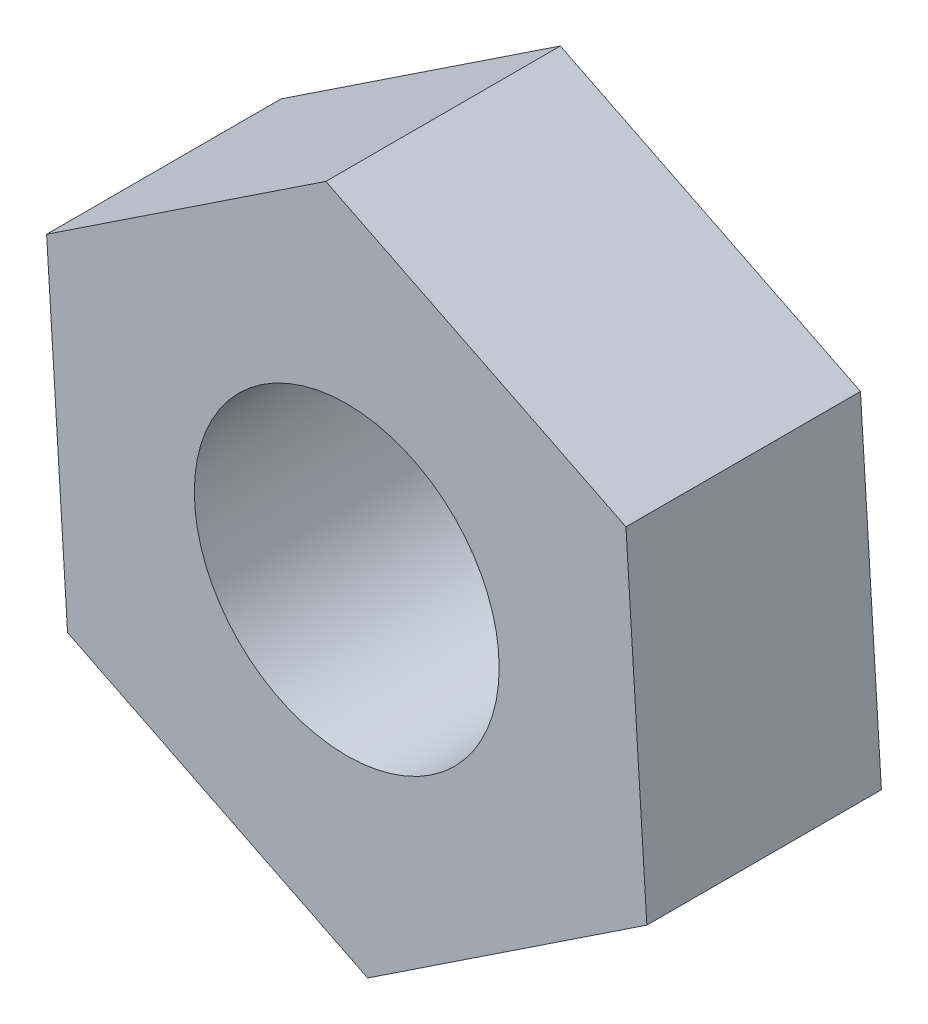
ISO-10303-21;
HEADER;
FILE_DESCRIPTION(('STEP AP214'),'2;1');
FILE_NAME('part.step','',(''),(''),'','','');
FILE_SCHEMA(('AUTOMOTIVE_DESIGN { 1 0 10303 214 1 1 1 1 }'));
ENDSEC;
DATA;
#1=APPLICATION_CONTEXT('core data for automotive mechanical design processes');
#2=APPLICATION_PROTOCOL_DEFINITION('international standard','automotive_design',2000,#1);
#3=PRODUCT_CONTEXT('',#1,'mechanical');
#4=PRODUCT('Part','Part','',(#3));
#5=PRODUCT_RELATED_PRODUCT_CATEGORY('part','',(#4));
#6=PRODUCT_DEFINITION_FORMATION('','',#4);
#7=PRODUCT_DEFINITION_CONTEXT('part definition',#1,'design');
#8=PRODUCT_DEFINITION('design','',#6,#7);
#9=PRODUCT_DEFINITION_SHAPE('','',#8);
#10=(LENGTH_UNIT() NAMED_UNIT(*) SI_UNIT(.MILLI.,.METRE.));
#11=(NAMED_UNIT(*) PLANE_ANGLE_UNIT() SI_UNIT($,.RADIAN.));
#12=(NAMED_UNIT(*) SI_UNIT($,.STERADIAN.) SOLID_ANGLE_UNIT());
#13=UNCERTAINTY_MEASURE_WITH_UNIT(LENGTH_MEASURE(1.E-05),#10,'distance_accuracy_value','');
#14=(GEOMETRIC_REPRESENTATION_CONTEXT(3) GLOBAL_UNCERTAINTY_ASSIGNED_CONTEXT((#13)) GLOBAL_UNIT_ASSIGNED_CONTEXT((#10,
#11,#12)) REPRESENTATION_CONTEXT('',''));
#15=CARTESIAN_POINT('',(0.,0.,0.));
#16=DIRECTION('',(0.,0.,1.));
#17=DIRECTION('',(1.,0.,0.));
#18=AXIS2_PLACEMENT_3D('',#15,#16,#17);
#19=CARTESIAN_POINT('',(-2.559430903004,1.27153979597499,2.));
#20=DIRECTION('',(0.998046892877419,0.06246918934746,0.));
#21=DIRECTION('',(-0.06246918934746,0.99804689287742,0.));
#22=AXIS2_PLACEMENT_3D('',#19,#20,#21);
#23=PLANE('',#22);
#24=DIRECTION('',(0.06246918934746,-0.998046892877419,0.));
#25=VECTOR('',#24,1.);
#26=CARTESIAN_POINT('',(-2.559430903004,1.27153979597499,0.));
#27=LINE('',#26,#25);
#28=CARTESIAN_POINT('',(-2.559430903004,1.27153979597499,0.));
#29=VERTEX_POINT('',#28);
#30=CARTESIAN_POINT('',(-2.38090121673922,-1.58076228324492,0.));
#31=VERTEX_POINT('',#30);
#32=EDGE_CURVE('E125',#29,#31,#27,.T.);
#33=ORIENTED_EDGE('',*,*,#32,.T.);
#34=DIRECTION('',(0.,0.,-1.));
#35=VECTOR('',#34,1.);
#36=CARTESIAN_POINT('',(-2.38090121673922,-1.58076228324492,2.));
#37=LINE('',#36,#35);
#38=CARTESIAN_POINT('',(-2.38090121673922,-1.58076228324492,2.));
#39=VERTEX_POINT('',#38);
#40=EDGE_CURVE('E11',#39,#31,#37,.T.);
#41=ORIENTED_EDGE('',*,*,#40,.F.);
#42=DIRECTION('',(0.06246918934746,-0.998046892877419,0.));
#43=VECTOR('',#42,1.);
#44=CARTESIAN_POINT('',(-2.559430903004,1.27153979597499,2.));
#45=LINE('',#44,#43);
#46=CARTESIAN_POINT('',(-2.559430903004,1.27153979597499,2.));
#47=VERTEX_POINT('',#46);
#48=EDGE_CURVE('E136',#47,#39,#45,.T.);
#49=ORIENTED_EDGE('',*,*,#48,.F.);
#50=DIRECTION('',(0.,0.,-1.));
#51=VECTOR('',#50,1.);
#52=CARTESIAN_POINT('',(-2.559430903004,1.27153979597499,2.));
#53=LINE('',#52,#51);
#54=EDGE_CURVE('E121',#47,#29,#53,.T.);
#55=ORIENTED_EDGE('',*,*,#54,.T.);
#56=EDGE_LOOP('',(#33,#41,#49,#55));
#57=FACE_BOUND('',#56,.T.);
#58=ADVANCED_FACE('F41',(#57),#23,.F.);
#59=CARTESIAN_POINT('',(-2.38090121673922,-1.58076228324492,2.));
#60=DIRECTION('',(0.444923541509989,0.895568558073701,0.));
#61=DIRECTION('',(-0.895568558073702,0.44492354150999,0.));
#62=AXIS2_PLACEMENT_3D('',#59,#60,#61);
#63=PLANE('',#62);
#64=DIRECTION('',(0.895568558073701,-0.444923541509989,0.));
#65=VECTOR('',#64,1.);
#66=CARTESIAN_POINT('',(-2.38090121673922,-1.58076228324492,0.));
#67=LINE('',#66,#65);
#68=CARTESIAN_POINT('',(0.178529686264778,-2.85230207921991,0.));
#69=VERTEX_POINT('',#68);
#70=EDGE_CURVE('E128',#31,#69,#67,.T.);
#71=ORIENTED_EDGE('',*,*,#70,.T.);
#72=DIRECTION('',(0.,0.,-1.));
#73=VECTOR('',#72,1.);
#74=CARTESIAN_POINT('',(0.178529686264778,-2.85230207921991,2.));
#75=LINE('',#74,#73);
#76=CARTESIAN_POINT('',(0.178529686264778,-2.85230207921991,2.));
#77=VERTEX_POINT('',#76);
#78=EDGE_CURVE('E49',#77,#69,#75,.T.);
#79=ORIENTED_EDGE('',*,*,#78,.F.);
#80=DIRECTION('',(0.895568558073701,-0.444923541509989,0.));
#81=VECTOR('',#80,1.);
#82=CARTESIAN_POINT('',(-2.38090121673922,-1.58076228324492,2.));
#83=LINE('',#82,#81);
#84=EDGE_CURVE('E94',#39,#77,#83,.T.);
#85=ORIENTED_EDGE('',*,*,#84,.F.);
#86=ORIENTED_EDGE('',*,*,#40,.T.);
#87=EDGE_LOOP('',(#71,#79,#85,#86));
#88=FACE_BOUND('',#87,.T.);
#89=ADVANCED_FACE('F161',(#88),#63,.F.);
#90=CARTESIAN_POINT('',(0.178529686264778,-2.85230207921991,2.));
#91=DIRECTION('',(-0.55312335136743,0.833099368726242,0.));
#92=DIRECTION('',(-0.833099368726242,-0.55312335136743,0.));
#93=AXIS2_PLACEMENT_3D('',#90,#91,#92);
#94=PLANE('',#93);
#95=DIRECTION('',(0.833099368726242,0.55312335136743,0.));
#96=VECTOR('',#95,1.);
#97=CARTESIAN_POINT('',(0.178529686264778,-2.85230207921991,0.));
#98=LINE('',#97,#96);
#99=CARTESIAN_POINT('',(2.559430903004,-1.27153979597499,0.));
#100=VERTEX_POINT('',#99);
#101=EDGE_CURVE('E131',#69,#100,#98,.T.);
#102=ORIENTED_EDGE('',*,*,#101,.T.);
#103=DIRECTION('',(0.,0.,-1.));
#104=VECTOR('',#103,1.);
#105=CARTESIAN_POINT('',(2.559430903004,-1.27153979597499,2.));
#106=LINE('',#105,#104);
#107=CARTESIAN_POINT('',(2.559430903004,-1.27153979597499,2.));
#108=VERTEX_POINT('',#107);
#109=EDGE_CURVE('E116',#108,#100,#106,.T.);
#110=ORIENTED_EDGE('',*,*,#109,.F.);
#111=DIRECTION('',(0.833099368726242,0.55312335136743,0.));
#112=VECTOR('',#111,1.);
#113=CARTESIAN_POINT('',(0.178529686264778,-2.85230207921991,2.));
#114=LINE('',#113,#112);
#115=EDGE_CURVE('E107',#77,#108,#114,.T.);
#116=ORIENTED_EDGE('',*,*,#115,.F.);
#117=ORIENTED_EDGE('',*,*,#78,.T.);
#118=EDGE_LOOP('',(#102,#110,#116,#117));
#119=FACE_BOUND('',#118,.T.);
#120=ADVANCED_FACE('F142',(#119),#94,.F.);
#121=CARTESIAN_POINT('',(2.559430903004,-1.27153979597499,2.));
#122=DIRECTION('',(-0.998046892877419,-0.0624691893474598,0.));
#123=DIRECTION('',(0.0624691893474598,-0.99804689287742,0.));
#124=AXIS2_PLACEMENT_3D('',#121,#122,#123);
#125=PLANE('',#124);
#126=DIRECTION('',(-0.0624691893474598,0.99804689287742,0.));
#127=VECTOR('',#126,1.);
#128=CARTESIAN_POINT('',(2.559430903004,-1.27153979597499,0.));
#129=LINE('',#128,#127);
#130=CARTESIAN_POINT('',(2.38090121673922,1.58076228324492,0.));
#131=VERTEX_POINT('',#130);
#132=EDGE_CURVE('E115',#100,#131,#129,.T.);
#133=ORIENTED_EDGE('',*,*,#132,.T.);
#134=DIRECTION('',(0.,0.,-1.));
#135=VECTOR('',#134,1.);
#136=CARTESIAN_POINT('',(2.38090121673922,1.58076228324492,2.));
#137=LINE('',#136,#135);
#138=CARTESIAN_POINT('',(2.38090121673922,1.58076228324492,2.));
#139=VERTEX_POINT('',#138);
#140=EDGE_CURVE('E112',#139,#131,#137,.T.);
#141=ORIENTED_EDGE('',*,*,#140,.F.);
#142=DIRECTION('',(-0.0624691893474598,0.99804689287742,0.));
#143=VECTOR('',#142,1.);
#144=CARTESIAN_POINT('',(2.559430903004,-1.27153979597499,2.));
#145=LINE('',#144,#143);
#146=EDGE_CURVE('E101',#108,#139,#145,.T.);
#147=ORIENTED_EDGE('',*,*,#146,.F.);
#148=ORIENTED_EDGE('',*,*,#109,.T.);
#149=EDGE_LOOP('',(#133,#141,#147,#148));
#150=FACE_BOUND('',#149,.T.);
#151=ADVANCED_FACE('F113',(#150),#125,.F.);
#152=CARTESIAN_POINT('',(2.38090121673922,1.58076228324492,2.));
#153=DIRECTION('',(-0.444923541509989,-0.895568558073702,0.));
#154=DIRECTION('',(0.895568558073702,-0.444923541509989,0.));
#155=AXIS2_PLACEMENT_3D('',#152,#153,#154);
#156=PLANE('',#155);
#157=DIRECTION('',(-0.895568558073702,0.444923541509989,0.));
#158=VECTOR('',#157,1.);
#159=CARTESIAN_POINT('',(2.38090121673922,1.58076228324492,0.));
#160=LINE('',#159,#158);
#161=CARTESIAN_POINT('',(-0.178529686264777,2.85230207921991,0.));
#162=VERTEX_POINT('',#161);
#163=EDGE_CURVE('E80',#131,#162,#160,.T.);
#164=ORIENTED_EDGE('',*,*,#163,.T.);
#165=DIRECTION('',(0.,0.,-1.));
#166=VECTOR('',#165,1.);
#167=CARTESIAN_POINT('',(-0.178529686264777,2.85230207921991,2.));
#168=LINE('',#167,#166);
#169=CARTESIAN_POINT('',(-0.178529686264777,2.85230207921991,2.));
#170=VERTEX_POINT('',#169);
#171=EDGE_CURVE('E117',#170,#162,#168,.T.);
#172=ORIENTED_EDGE('',*,*,#171,.F.);
#173=DIRECTION('',(-0.895568558073702,0.444923541509989,0.));
#174=VECTOR('',#173,1.);
#175=CARTESIAN_POINT('',(2.38090121673922,1.58076228324492,2.));
#176=LINE('',#175,#174);
#177=EDGE_CURVE('E105',#139,#170,#176,.T.);
#178=ORIENTED_EDGE('',*,*,#177,.F.);
#179=ORIENTED_EDGE('',*,*,#140,.T.);
#180=EDGE_LOOP('',(#164,#172,#178,#179));
#181=FACE_BOUND('',#180,.T.);
#182=ADVANCED_FACE('F119',(#181),#156,.F.);
#183=CARTESIAN_POINT('',(-0.178529686264777,2.85230207921991,2.));
#184=DIRECTION('',(0.55312335136743,-0.833099368726242,0.));
#185=DIRECTION('',(0.833099368726242,0.55312335136743,0.));
#186=AXIS2_PLACEMENT_3D('',#183,#184,#185);
#187=PLANE('',#186);
#188=DIRECTION('',(-0.833099368726242,-0.55312335136743,0.));
#189=VECTOR('',#188,1.);
#190=CARTESIAN_POINT('',(-0.178529686264777,2.85230207921991,0.));
#191=LINE('',#190,#189);
#192=EDGE_CURVE('E86',#162,#29,#191,.T.);
#193=ORIENTED_EDGE('',*,*,#192,.T.);
#194=ORIENTED_EDGE('',*,*,#54,.F.);
#195=DIRECTION('',(-0.833099368726242,-0.55312335136743,0.));
#196=VECTOR('',#195,1.);
#197=CARTESIAN_POINT('',(-0.178529686264777,2.85230207921991,2.));
#198=LINE('',#197,#196);
#199=EDGE_CURVE('E57',#170,#47,#198,.T.);
#200=ORIENTED_EDGE('',*,*,#199,.F.);
#201=ORIENTED_EDGE('',*,*,#171,.T.);
#202=EDGE_LOOP('',(#193,#194,#200,#201));
#203=FACE_BOUND('',#202,.T.);
#204=ADVANCED_FACE('F149',(#203),#187,.F.);
#205=CARTESIAN_POINT('',(0.,0.,2.));
#206=DIRECTION('',(0.,0.,1.));
#207=DIRECTION('',(1.,0.,0.));
#208=AXIS2_PLACEMENT_3D('',#205,#206,#207);
#209=PLANE('',#208);
#210=CARTESIAN_POINT('',(0.,0.,2.));
#211=DIRECTION('',(0.,0.,1.));
#212=DIRECTION('',(1.,0.,0.));
#213=AXIS2_PLACEMENT_3D('',#210,#211,#212);
#214=CIRCLE('',#213,1.3);
#215=CARTESIAN_POINT('',(1.3,0.,2.));
#216=VERTEX_POINT('',#215);
#217=EDGE_CURVE('E217',#216,#216,#214,.T.);
#218=ORIENTED_EDGE('',*,*,#217,.F.);
#219=EDGE_LOOP('',(#218));
#220=FACE_BOUND('',#219,.T.);
#221=ORIENTED_EDGE('',*,*,#48,.T.);
#222=ORIENTED_EDGE('',*,*,#84,.T.);
#223=ORIENTED_EDGE('',*,*,#115,.T.);
#224=ORIENTED_EDGE('',*,*,#146,.T.);
#225=ORIENTED_EDGE('',*,*,#177,.T.);
#226=ORIENTED_EDGE('',*,*,#199,.T.);
#227=EDGE_LOOP('',(#221,#222,#223,#224,#225,#226));
#228=FACE_BOUND('',#227,.T.);
#229=ADVANCED_FACE('F103',(#220,#228),#209,.T.);
#230=CARTESIAN_POINT('',(0.,0.,0.));
#231=DIRECTION('',(0.,0.,1.));
#232=DIRECTION('',(1.,0.,0.));
#233=AXIS2_PLACEMENT_3D('',#230,#231,#232);
#234=PLANE('',#233);
#235=CARTESIAN_POINT('',(0.,0.,0.));
#236=DIRECTION('',(0.,0.,1.));
#237=DIRECTION('',(1.,0.,0.));
#238=AXIS2_PLACEMENT_3D('',#235,#236,#237);
#239=CIRCLE('',#238,1.3);
#240=CARTESIAN_POINT('',(1.3,0.,0.));
#241=VERTEX_POINT('',#240);
#242=EDGE_CURVE('E129',#241,#241,#239,.T.);
#243=ORIENTED_EDGE('',*,*,#242,.T.);
#244=EDGE_LOOP('',(#243));
#245=FACE_BOUND('',#244,.T.);
#246=ORIENTED_EDGE('',*,*,#32,.F.);
#247=ORIENTED_EDGE('',*,*,#192,.F.);
#248=ORIENTED_EDGE('',*,*,#163,.F.);
#249=ORIENTED_EDGE('',*,*,#132,.F.);
#250=ORIENTED_EDGE('',*,*,#101,.F.);
#251=ORIENTED_EDGE('',*,*,#70,.F.);
#252=EDGE_LOOP('',(#246,#247,#248,#249,#250,#251));
#253=FACE_BOUND('',#252,.T.);
#254=ADVANCED_FACE('F145',(#245,#253),#234,.F.);
#255=CARTESIAN_POINT('',(0.,0.,0.));
#256=DIRECTION('',(0.,0.,1.));
#257=DIRECTION('',(1.,0.,0.));
#258=AXIS2_PLACEMENT_3D('',#255,#256,#257);
#259=CYLINDRICAL_SURFACE('',#258,1.3);
#260=ORIENTED_EDGE('',*,*,#242,.F.);
#261=EDGE_LOOP('',(#260));
#262=FACE_BOUND('',#261,.T.);
#263=ORIENTED_EDGE('',*,*,#217,.T.);
#264=EDGE_LOOP('',(#263));
#265=FACE_BOUND('',#264,.T.);
#266=ADVANCED_FACE('F200',(#262,#265),#259,.F.);
#267=CLOSED_SHELL('',(#58,#89,#120,#151,#182,#204,#229,#254,#266));
#268=MANIFOLD_SOLID_BREP('B2',#267);
#269=ADVANCED_BREP_SHAPE_REPRESENTATION('',(#18,#268),#14);
#270=SHAPE_DEFINITION_REPRESENTATION(#9,#269);
ENDSEC;
END-ISO-10303-21;
